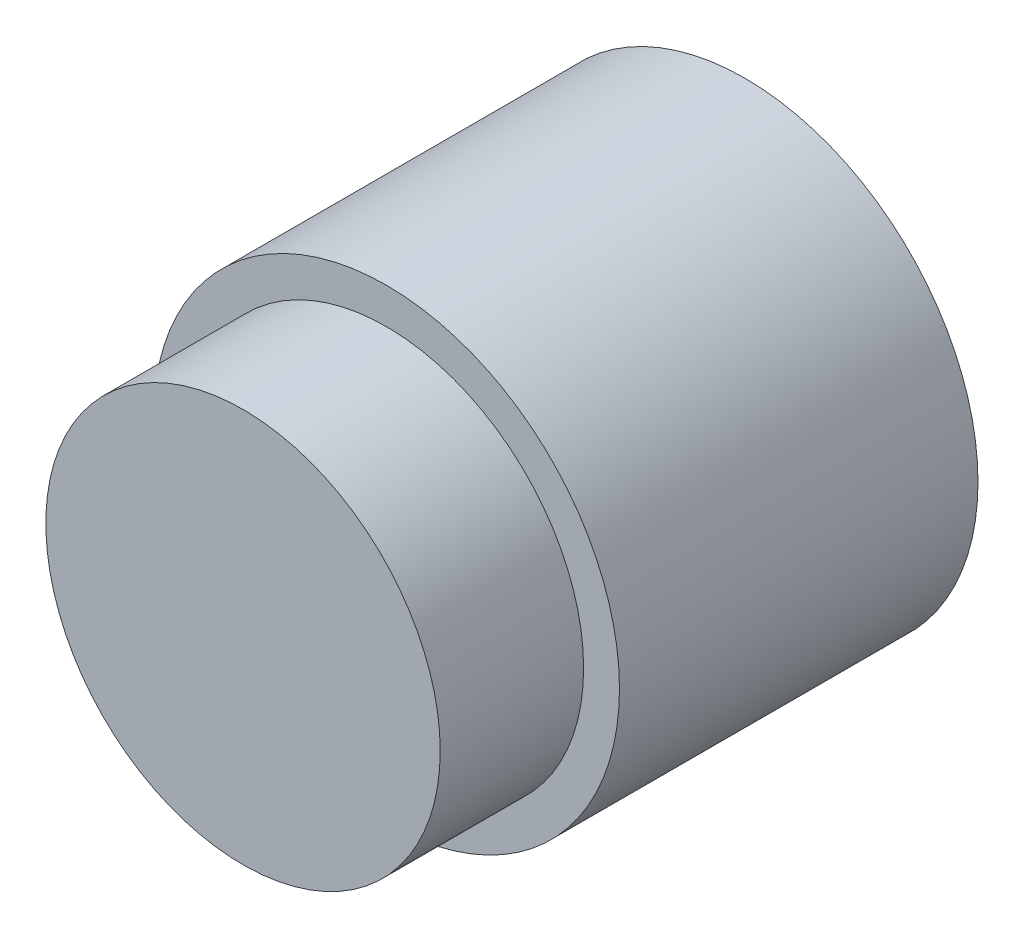
ISO-10303-21;
HEADER;
FILE_DESCRIPTION(('STEP AP214'),'2;1');
FILE_NAME('part.step','',(''),(''),'','','');
FILE_SCHEMA(('AUTOMOTIVE_DESIGN { 1 0 10303 214 1 1 1 1 }'));
ENDSEC;
DATA;
#1=APPLICATION_CONTEXT('core data for automotive mechanical design processes');
#2=APPLICATION_PROTOCOL_DEFINITION('international standard','automotive_design',2000,#1);
#3=PRODUCT_CONTEXT('',#1,'mechanical');
#4=PRODUCT('Part','Part','',(#3));
#5=PRODUCT_RELATED_PRODUCT_CATEGORY('part','',(#4));
#6=PRODUCT_DEFINITION_FORMATION('','',#4);
#7=PRODUCT_DEFINITION_CONTEXT('part definition',#1,'design');
#8=PRODUCT_DEFINITION('design','',#6,#7);
#9=PRODUCT_DEFINITION_SHAPE('','',#8);
#10=(LENGTH_UNIT() NAMED_UNIT(*) SI_UNIT(.MILLI.,.METRE.));
#11=(NAMED_UNIT(*) PLANE_ANGLE_UNIT() SI_UNIT($,.RADIAN.));
#12=(NAMED_UNIT(*) SI_UNIT($,.STERADIAN.) SOLID_ANGLE_UNIT());
#13=UNCERTAINTY_MEASURE_WITH_UNIT(LENGTH_MEASURE(1.E-05),#10,'distance_accuracy_value','');
#14=(GEOMETRIC_REPRESENTATION_CONTEXT(3) GLOBAL_UNCERTAINTY_ASSIGNED_CONTEXT((#13)) GLOBAL_UNIT_ASSIGNED_CONTEXT((#10,
#11,#12)) REPRESENTATION_CONTEXT('',''));
#15=CARTESIAN_POINT('',(0.,0.,0.));
#16=DIRECTION('',(0.,0.,1.));
#17=DIRECTION('',(1.,0.,0.));
#18=AXIS2_PLACEMENT_3D('',#15,#16,#17);
#19=CARTESIAN_POINT('',(0.,0.,1.));
#20=DIRECTION('',(0.,0.,-1.));
#21=DIRECTION('',(-1.,0.,0.));
#22=AXIS2_PLACEMENT_3D('',#19,#20,#21);
#23=CYLINDRICAL_SURFACE('',#22,0.650000000000001);
#24=CARTESIAN_POINT('',(0.,0.,1.));
#25=DIRECTION('',(0.,0.,1.));
#26=DIRECTION('',(1.,0.,0.));
#27=AXIS2_PLACEMENT_3D('',#24,#25,#26);
#28=CIRCLE('',#27,0.650000000000001);
#29=CARTESIAN_POINT('',(0.650000000000001,0.,1.));
#30=VERTEX_POINT('',#29);
#31=EDGE_CURVE('E38',#30,#30,#28,.T.);
#32=ORIENTED_EDGE('',*,*,#31,.F.);
#33=EDGE_LOOP('',(#32));
#34=FACE_BOUND('',#33,.T.);
#35=CARTESIAN_POINT('',(0.,0.,0.));
#36=DIRECTION('',(0.,0.,1.));
#37=DIRECTION('',(1.,0.,0.));
#38=AXIS2_PLACEMENT_3D('',#35,#36,#37);
#39=CIRCLE('',#38,0.650000000000001);
#40=CARTESIAN_POINT('',(0.650000000000001,0.,0.));
#41=VERTEX_POINT('',#40);
#42=EDGE_CURVE('E34',#41,#41,#39,.T.);
#43=ORIENTED_EDGE('',*,*,#42,.T.);
#44=EDGE_LOOP('',(#43));
#45=FACE_BOUND('',#44,.T.);
#46=ADVANCED_FACE('F31',(#34,#45),#23,.T.);
#47=CARTESIAN_POINT('',(0.,0.,1.));
#48=DIRECTION('',(0.,0.,1.));
#49=DIRECTION('',(1.,0.,0.));
#50=AXIS2_PLACEMENT_3D('',#47,#48,#49);
#51=PLANE('',#50);
#52=CARTESIAN_POINT('',(0.,0.,1.));
#53=DIRECTION('',(0.,0.,1.));
#54=DIRECTION('',(1.,0.,0.));
#55=AXIS2_PLACEMENT_3D('',#52,#53,#54);
#56=CIRCLE('',#55,0.55);
#57=CARTESIAN_POINT('',(0.55,0.,1.));
#58=VERTEX_POINT('',#57);
#59=EDGE_CURVE('E10',#58,#58,#56,.T.);
#60=ORIENTED_EDGE('',*,*,#59,.F.);
#61=EDGE_LOOP('',(#60));
#62=FACE_BOUND('',#61,.T.);
#63=ORIENTED_EDGE('',*,*,#31,.T.);
#64=EDGE_LOOP('',(#63));
#65=FACE_BOUND('',#64,.T.);
#66=ADVANCED_FACE('F55',(#62,#65),#51,.T.);
#67=CARTESIAN_POINT('',(0.,0.,0.));
#68=DIRECTION('',(0.,0.,1.));
#69=DIRECTION('',(1.,0.,0.));
#70=AXIS2_PLACEMENT_3D('',#67,#68,#69);
#71=PLANE('',#70);
#72=ORIENTED_EDGE('',*,*,#42,.F.);
#73=EDGE_LOOP('',(#72));
#74=FACE_BOUND('',#73,.T.);
#75=ADVANCED_FACE('F52',(#74),#71,.F.);
#76=CARTESIAN_POINT('',(0.,0.,1.4));
#77=DIRECTION('',(0.,0.,-1.));
#78=DIRECTION('',(-1.,0.,0.));
#79=AXIS2_PLACEMENT_3D('',#76,#77,#78);
#80=CYLINDRICAL_SURFACE('',#79,0.55);
#81=CARTESIAN_POINT('',(0.,0.,1.4));
#82=DIRECTION('',(0.,0.,1.));
#83=DIRECTION('',(1.,0.,0.));
#84=AXIS2_PLACEMENT_3D('',#81,#82,#83);
#85=CIRCLE('',#84,0.55);
#86=CARTESIAN_POINT('',(0.55,0.,1.4));
#87=VERTEX_POINT('',#86);
#88=EDGE_CURVE('E44',#87,#87,#85,.T.);
#89=ORIENTED_EDGE('',*,*,#88,.F.);
#90=EDGE_LOOP('',(#89));
#91=FACE_BOUND('',#90,.T.);
#92=ORIENTED_EDGE('',*,*,#59,.T.);
#93=EDGE_LOOP('',(#92));
#94=FACE_BOUND('',#93,.T.);
#95=ADVANCED_FACE('F54',(#91,#94),#80,.T.);
#96=CARTESIAN_POINT('',(0.,0.,1.4));
#97=DIRECTION('',(0.,0.,1.));
#98=DIRECTION('',(1.,0.,0.));
#99=AXIS2_PLACEMENT_3D('',#96,#97,#98);
#100=PLANE('',#99);
#101=ORIENTED_EDGE('',*,*,#88,.T.);
#102=EDGE_LOOP('',(#101));
#103=FACE_BOUND('',#102,.T.);
#104=ADVANCED_FACE('F60',(#103),#100,.T.);
#105=CLOSED_SHELL('',(#46,#66,#75,#95,#104));
#106=MANIFOLD_SOLID_BREP('B2',#105);
#107=ADVANCED_BREP_SHAPE_REPRESENTATION('',(#18,#106),#14);
#108=SHAPE_DEFINITION_REPRESENTATION(#9,#107);
ENDSEC;
END-ISO-10303-21;
